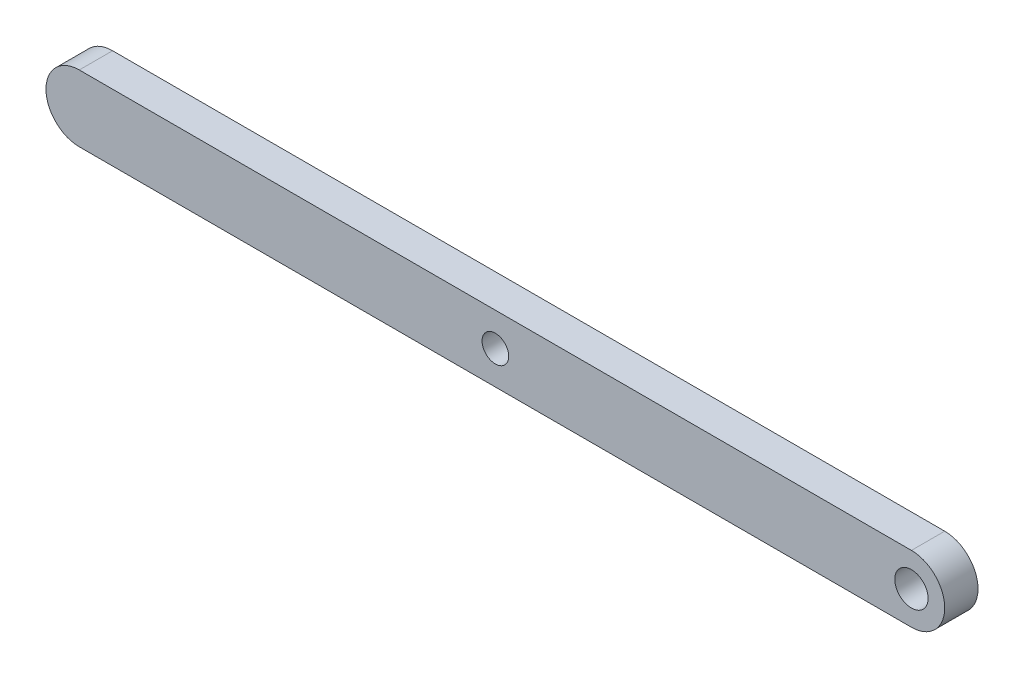
ISO-10303-21;
HEADER;
FILE_DESCRIPTION(('STEP AP214'),'2;1');
FILE_NAME('part.step','',(''),(''),'','','');
FILE_SCHEMA(('AUTOMOTIVE_DESIGN { 1 0 10303 214 1 1 1 1 }'));
ENDSEC;
DATA;
#1=APPLICATION_CONTEXT('core data for automotive mechanical design processes');
#2=APPLICATION_PROTOCOL_DEFINITION('international standard','automotive_design',2000,#1);
#3=PRODUCT_CONTEXT('',#1,'mechanical');
#4=PRODUCT('Part','Part','',(#3));
#5=PRODUCT_RELATED_PRODUCT_CATEGORY('part','',(#4));
#6=PRODUCT_DEFINITION_FORMATION('','',#4);
#7=PRODUCT_DEFINITION_CONTEXT('part definition',#1,'design');
#8=PRODUCT_DEFINITION('design','',#6,#7);
#9=PRODUCT_DEFINITION_SHAPE('','',#8);
#10=(LENGTH_UNIT() NAMED_UNIT(*) SI_UNIT(.MILLI.,.METRE.));
#11=(NAMED_UNIT(*) PLANE_ANGLE_UNIT() SI_UNIT($,.RADIAN.));
#12=(NAMED_UNIT(*) SI_UNIT($,.STERADIAN.) SOLID_ANGLE_UNIT());
#13=UNCERTAINTY_MEASURE_WITH_UNIT(LENGTH_MEASURE(1.E-05),#10,'distance_accuracy_value','');
#14=(GEOMETRIC_REPRESENTATION_CONTEXT(3) GLOBAL_UNCERTAINTY_ASSIGNED_CONTEXT((#13)) GLOBAL_UNIT_ASSIGNED_CONTEXT((#10,
#11,#12)) REPRESENTATION_CONTEXT('',''));
#15=CARTESIAN_POINT('',(0.,0.,0.));
#16=DIRECTION('',(0.,0.,1.));
#17=DIRECTION('',(1.,0.,0.));
#18=AXIS2_PLACEMENT_3D('',#15,#16,#17);
#19=CARTESIAN_POINT('',(-125.,0.,10.));
#20=DIRECTION('',(0.,0.,1.));
#21=DIRECTION('',(1.,0.,0.));
#22=AXIS2_PLACEMENT_3D('',#19,#20,#21);
#23=PLANE('',#22);
#24=CARTESIAN_POINT('',(0.,0.,10.));
#25=DIRECTION('',(0.,0.,1.));
#26=DIRECTION('',(1.,0.,0.));
#27=AXIS2_PLACEMENT_3D('',#24,#25,#26);
#28=CIRCLE('',#27,4.);
#29=CARTESIAN_POINT('',(4.00000000000001,0.,10.));
#30=VERTEX_POINT('',#29);
#31=EDGE_CURVE('E100',#30,#30,#28,.T.);
#32=ORIENTED_EDGE('',*,*,#31,.F.);
#33=EDGE_LOOP('',(#32));
#34=FACE_BOUND('',#33,.T.);
#35=CARTESIAN_POINT('',(-125.,0.,10.));
#36=DIRECTION('',(0.,0.,1.));
#37=DIRECTION('',(1.,0.,0.));
#38=AXIS2_PLACEMENT_3D('',#35,#36,#37);
#39=CIRCLE('',#38,10.);
#40=CARTESIAN_POINT('',(-125.,9.99999999999998,10.));
#41=VERTEX_POINT('',#40);
#42=CARTESIAN_POINT('',(-125.,-10.,10.));
#43=VERTEX_POINT('',#42);
#44=EDGE_CURVE('E85',#41,#43,#39,.T.);
#45=ORIENTED_EDGE('',*,*,#44,.T.);
#46=DIRECTION('',(1.,0.,0.));
#47=VECTOR('',#46,1.);
#48=CARTESIAN_POINT('',(125.,-9.99999999999998,10.));
#49=LINE('',#48,#47);
#50=CARTESIAN_POINT('',(125.,-9.99999999999999,10.));
#51=VERTEX_POINT('',#50);
#52=EDGE_CURVE('E80',#43,#51,#49,.T.);
#53=ORIENTED_EDGE('',*,*,#52,.T.);
#54=CARTESIAN_POINT('',(125.,0.,10.));
#55=DIRECTION('',(0.,0.,1.));
#56=DIRECTION('',(1.,0.,0.));
#57=AXIS2_PLACEMENT_3D('',#54,#55,#56);
#58=CIRCLE('',#57,10.);
#59=CARTESIAN_POINT('',(125.,10.,10.));
#60=VERTEX_POINT('',#59);
#61=EDGE_CURVE('E83',#51,#60,#58,.T.);
#62=ORIENTED_EDGE('',*,*,#61,.T.);
#63=DIRECTION('',(-1.,0.,0.));
#64=VECTOR('',#63,1.);
#65=CARTESIAN_POINT('',(125.,10.,10.));
#66=LINE('',#65,#64);
#67=EDGE_CURVE('E50',#60,#41,#66,.T.);
#68=ORIENTED_EDGE('',*,*,#67,.T.);
#69=EDGE_LOOP('',(#45,#53,#62,#68));
#70=FACE_BOUND('',#69,.T.);
#71=CARTESIAN_POINT('',(125.,0.,10.));
#72=DIRECTION('',(0.,0.,1.));
#73=DIRECTION('',(1.,0.,0.));
#74=AXIS2_PLACEMENT_3D('',#71,#72,#73);
#75=CIRCLE('',#74,4.99999999999999);
#76=CARTESIAN_POINT('',(130.,0.,10.));
#77=VERTEX_POINT('',#76);
#78=EDGE_CURVE('E115',#77,#77,#75,.T.);
#79=ORIENTED_EDGE('',*,*,#78,.F.);
#80=EDGE_LOOP('',(#79));
#81=FACE_BOUND('',#80,.T.);
#82=ADVANCED_FACE('F33',(#34,#70,#81),#23,.T.);
#83=CARTESIAN_POINT('',(-125.,0.,0.));
#84=DIRECTION('',(0.,0.,1.));
#85=DIRECTION('',(1.,0.,0.));
#86=AXIS2_PLACEMENT_3D('',#83,#84,#85);
#87=PLANE('',#86);
#88=CARTESIAN_POINT('',(-125.,0.,0.));
#89=DIRECTION('',(0.,0.,1.));
#90=DIRECTION('',(1.,0.,0.));
#91=AXIS2_PLACEMENT_3D('',#88,#89,#90);
#92=CIRCLE('',#91,10.);
#93=CARTESIAN_POINT('',(-125.,9.99999999999998,0.));
#94=VERTEX_POINT('',#93);
#95=CARTESIAN_POINT('',(-125.,-10.,0.));
#96=VERTEX_POINT('',#95);
#97=EDGE_CURVE('E97',#94,#96,#92,.T.);
#98=ORIENTED_EDGE('',*,*,#97,.F.);
#99=DIRECTION('',(-1.,0.,0.));
#100=VECTOR('',#99,1.);
#101=CARTESIAN_POINT('',(125.,10.,0.));
#102=LINE('',#101,#100);
#103=CARTESIAN_POINT('',(125.,10.,0.));
#104=VERTEX_POINT('',#103);
#105=EDGE_CURVE('E73',#104,#94,#102,.T.);
#106=ORIENTED_EDGE('',*,*,#105,.F.);
#107=CARTESIAN_POINT('',(125.,0.,0.));
#108=DIRECTION('',(0.,0.,1.));
#109=DIRECTION('',(1.,0.,0.));
#110=AXIS2_PLACEMENT_3D('',#107,#108,#109);
#111=CIRCLE('',#110,10.);
#112=CARTESIAN_POINT('',(125.,-9.99999999999999,0.));
#113=VERTEX_POINT('',#112);
#114=EDGE_CURVE('E67',#113,#104,#111,.T.);
#115=ORIENTED_EDGE('',*,*,#114,.F.);
#116=DIRECTION('',(1.,0.,0.));
#117=VECTOR('',#116,1.);
#118=CARTESIAN_POINT('',(125.,-9.99999999999998,0.));
#119=LINE('',#118,#117);
#120=EDGE_CURVE('E89',#96,#113,#119,.T.);
#121=ORIENTED_EDGE('',*,*,#120,.F.);
#122=EDGE_LOOP('',(#98,#106,#115,#121));
#123=FACE_BOUND('',#122,.T.);
#124=CARTESIAN_POINT('',(0.,0.,0.));
#125=DIRECTION('',(0.,0.,1.));
#126=DIRECTION('',(1.,0.,0.));
#127=AXIS2_PLACEMENT_3D('',#124,#125,#126);
#128=CIRCLE('',#127,4.);
#129=CARTESIAN_POINT('',(4.00000000000001,0.,0.));
#130=VERTEX_POINT('',#129);
#131=EDGE_CURVE('E112',#130,#130,#128,.T.);
#132=ORIENTED_EDGE('',*,*,#131,.T.);
#133=EDGE_LOOP('',(#132));
#134=FACE_BOUND('',#133,.T.);
#135=CARTESIAN_POINT('',(125.,0.,0.));
#136=DIRECTION('',(0.,0.,1.));
#137=DIRECTION('',(1.,0.,0.));
#138=AXIS2_PLACEMENT_3D('',#135,#136,#137);
#139=CIRCLE('',#138,4.99999999999999);
#140=CARTESIAN_POINT('',(130.,0.,0.));
#141=VERTEX_POINT('',#140);
#142=EDGE_CURVE('E118',#141,#141,#139,.T.);
#143=ORIENTED_EDGE('',*,*,#142,.T.);
#144=EDGE_LOOP('',(#143));
#145=FACE_BOUND('',#144,.T.);
#146=ADVANCED_FACE('F108',(#123,#134,#145),#87,.F.);
#147=CARTESIAN_POINT('',(-125.,0.,10.));
#148=DIRECTION('',(0.,0.,-1.));
#149=DIRECTION('',(-1.,0.,0.));
#150=AXIS2_PLACEMENT_3D('',#147,#148,#149);
#151=CYLINDRICAL_SURFACE('',#150,10.);
#152=ORIENTED_EDGE('',*,*,#97,.T.);
#153=DIRECTION('',(0.,0.,-1.));
#154=VECTOR('',#153,1.);
#155=CARTESIAN_POINT('',(-125.,-10.,10.));
#156=LINE('',#155,#154);
#157=EDGE_CURVE('E11',#43,#96,#156,.T.);
#158=ORIENTED_EDGE('',*,*,#157,.F.);
#159=ORIENTED_EDGE('',*,*,#44,.F.);
#160=DIRECTION('',(0.,0.,-1.));
#161=VECTOR('',#160,1.);
#162=CARTESIAN_POINT('',(-125.,9.99999999999998,10.));
#163=LINE('',#162,#161);
#164=EDGE_CURVE('E93',#41,#94,#163,.T.);
#165=ORIENTED_EDGE('',*,*,#164,.T.);
#166=EDGE_LOOP('',(#152,#158,#159,#165));
#167=FACE_BOUND('',#166,.T.);
#168=ADVANCED_FACE('F35',(#167),#151,.T.);
#169=CARTESIAN_POINT('',(125.,-9.99999999999998,10.));
#170=DIRECTION('',(0.,1.,0.));
#171=DIRECTION('',(-1.,0.,0.));
#172=AXIS2_PLACEMENT_3D('',#169,#170,#171);
#173=PLANE('',#172);
#174=ORIENTED_EDGE('',*,*,#120,.T.);
#175=DIRECTION('',(0.,0.,-1.));
#176=VECTOR('',#175,1.);
#177=CARTESIAN_POINT('',(125.,-9.99999999999999,10.));
#178=LINE('',#177,#176);
#179=EDGE_CURVE('E42',#51,#113,#178,.T.);
#180=ORIENTED_EDGE('',*,*,#179,.F.);
#181=ORIENTED_EDGE('',*,*,#52,.F.);
#182=ORIENTED_EDGE('',*,*,#157,.T.);
#183=EDGE_LOOP('',(#174,#180,#181,#182));
#184=FACE_BOUND('',#183,.T.);
#185=ADVANCED_FACE('F88',(#184),#173,.F.);
#186=CARTESIAN_POINT('',(125.,0.,10.));
#187=DIRECTION('',(0.,0.,-1.));
#188=DIRECTION('',(-1.,0.,0.));
#189=AXIS2_PLACEMENT_3D('',#186,#187,#188);
#190=CYLINDRICAL_SURFACE('',#189,10.);
#191=ORIENTED_EDGE('',*,*,#114,.T.);
#192=DIRECTION('',(0.,0.,-1.));
#193=VECTOR('',#192,1.);
#194=CARTESIAN_POINT('',(125.,10.,10.));
#195=LINE('',#194,#193);
#196=EDGE_CURVE('E90',#60,#104,#195,.T.);
#197=ORIENTED_EDGE('',*,*,#196,.F.);
#198=ORIENTED_EDGE('',*,*,#61,.F.);
#199=ORIENTED_EDGE('',*,*,#179,.T.);
#200=EDGE_LOOP('',(#191,#197,#198,#199));
#201=FACE_BOUND('',#200,.T.);
#202=ADVANCED_FACE('F91',(#201),#190,.T.);
#203=CARTESIAN_POINT('',(125.,10.,10.));
#204=DIRECTION('',(0.,-1.,0.));
#205=DIRECTION('',(1.,0.,0.));
#206=AXIS2_PLACEMENT_3D('',#203,#204,#205);
#207=PLANE('',#206);
#208=ORIENTED_EDGE('',*,*,#105,.T.);
#209=ORIENTED_EDGE('',*,*,#164,.F.);
#210=ORIENTED_EDGE('',*,*,#67,.F.);
#211=ORIENTED_EDGE('',*,*,#196,.T.);
#212=EDGE_LOOP('',(#208,#209,#210,#211));
#213=FACE_BOUND('',#212,.T.);
#214=ADVANCED_FACE('F105',(#213),#207,.F.);
#215=CARTESIAN_POINT('',(0.,0.,10.));
#216=DIRECTION('',(0.,0.,-1.));
#217=DIRECTION('',(-1.,0.,0.));
#218=AXIS2_PLACEMENT_3D('',#215,#216,#217);
#219=CYLINDRICAL_SURFACE('',#218,4.);
#220=ORIENTED_EDGE('',*,*,#31,.T.);
#221=EDGE_LOOP('',(#220));
#222=FACE_BOUND('',#221,.T.);
#223=ORIENTED_EDGE('',*,*,#131,.F.);
#224=EDGE_LOOP('',(#223));
#225=FACE_BOUND('',#224,.T.);
#226=ADVANCED_FACE('F135',(#222,#225),#219,.F.);
#227=CARTESIAN_POINT('',(125.,0.,10.));
#228=DIRECTION('',(0.,0.,-1.));
#229=DIRECTION('',(-1.,0.,0.));
#230=AXIS2_PLACEMENT_3D('',#227,#228,#229);
#231=CYLINDRICAL_SURFACE('',#230,4.99999999999999);
#232=ORIENTED_EDGE('',*,*,#78,.T.);
#233=EDGE_LOOP('',(#232));
#234=FACE_BOUND('',#233,.T.);
#235=ORIENTED_EDGE('',*,*,#142,.F.);
#236=EDGE_LOOP('',(#235));
#237=FACE_BOUND('',#236,.T.);
#238=ADVANCED_FACE('F124',(#234,#237),#231,.F.);
#239=CLOSED_SHELL('',(#82,#146,#168,#185,#202,#214,#226,#238));
#240=MANIFOLD_SOLID_BREP('B2',#239);
#241=ADVANCED_BREP_SHAPE_REPRESENTATION('',(#18,#240),#14);
#242=SHAPE_DEFINITION_REPRESENTATION(#9,#241);
ENDSEC;
END-ISO-10303-21;
